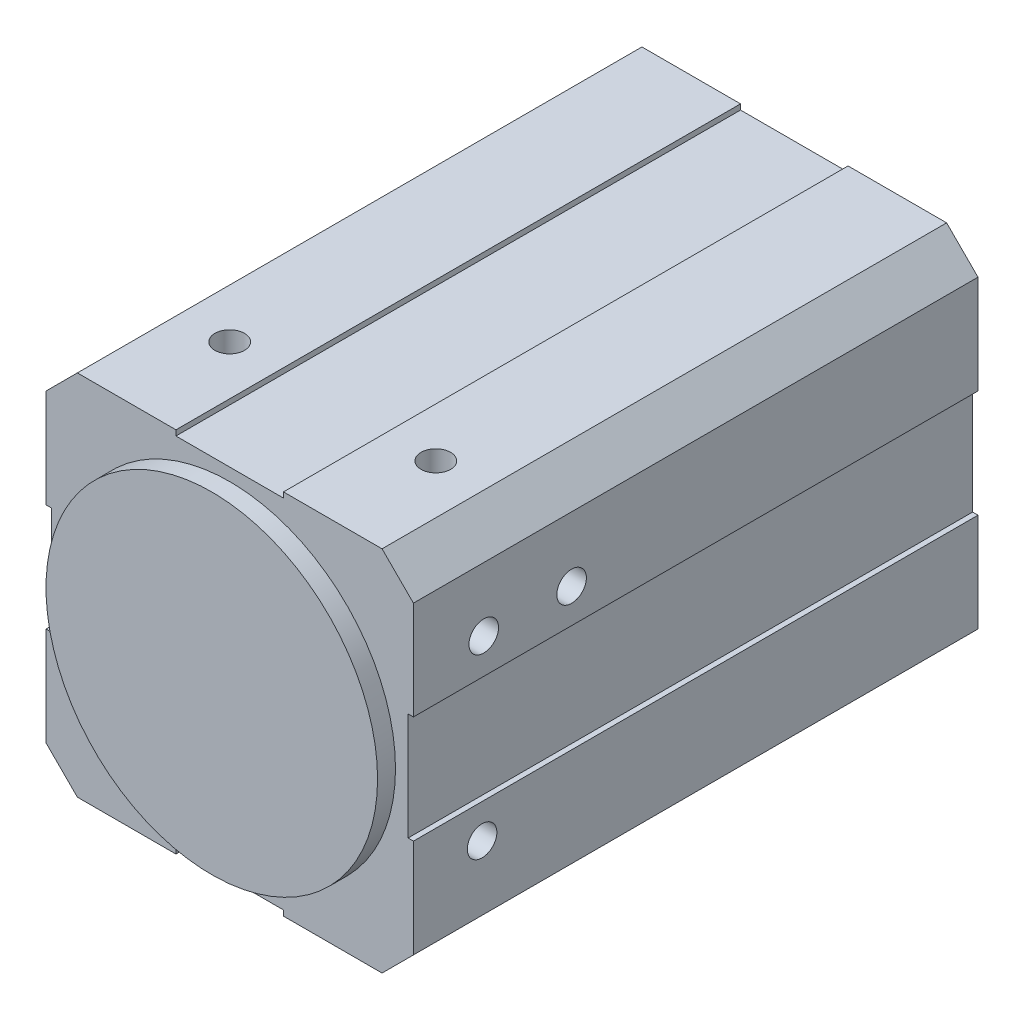
ISO-10303-21;
HEADER;
FILE_DESCRIPTION(('STEP AP214'),'2;1');
FILE_NAME('part.step','',(''),(''),'','','');
FILE_SCHEMA(('AUTOMOTIVE_DESIGN { 1 0 10303 214 1 1 1 1 }'));
ENDSEC;
DATA;
#1=APPLICATION_CONTEXT('core data for automotive mechanical design processes');
#2=APPLICATION_PROTOCOL_DEFINITION('international standard','automotive_design',2000,#1);
#3=PRODUCT_CONTEXT('',#1,'mechanical');
#4=PRODUCT('Part','Part','',(#3));
#5=PRODUCT_RELATED_PRODUCT_CATEGORY('part','',(#4));
#6=PRODUCT_DEFINITION_FORMATION('','',#4);
#7=PRODUCT_DEFINITION_CONTEXT('part definition',#1,'design');
#8=PRODUCT_DEFINITION('design','',#6,#7);
#9=PRODUCT_DEFINITION_SHAPE('','',#8);
#10=(LENGTH_UNIT() NAMED_UNIT(*) SI_UNIT(.MILLI.,.METRE.));
#11=(NAMED_UNIT(*) PLANE_ANGLE_UNIT() SI_UNIT($,.RADIAN.));
#12=(NAMED_UNIT(*) SI_UNIT($,.STERADIAN.) SOLID_ANGLE_UNIT());
#13=UNCERTAINTY_MEASURE_WITH_UNIT(LENGTH_MEASURE(1.E-05),#10,'distance_accuracy_value','');
#14=(GEOMETRIC_REPRESENTATION_CONTEXT(3) GLOBAL_UNCERTAINTY_ASSIGNED_CONTEXT((#13)) GLOBAL_UNIT_ASSIGNED_CONTEXT((#10,
#11,#12)) REPRESENTATION_CONTEXT('',''));
#15=CARTESIAN_POINT('',(0.,0.,0.));
#16=DIRECTION('',(0.,0.,1.));
#17=DIRECTION('',(1.,0.,0.));
#18=AXIS2_PLACEMENT_3D('',#15,#16,#17);
#19=CARTESIAN_POINT('',(20.5,41.,-31.5));
#20=DIRECTION('',(-1.,0.,0.));
#21=DIRECTION('',(0.,0.,1.));
#22=AXIS2_PLACEMENT_3D('',#19,#20,#21);
#23=PLANE('',#22);
#24=CARTESIAN_POINT('',(20.5,10.704410149387,23.839572383917));
#25=DIRECTION('',(1.,0.,0.));
#26=DIRECTION('',(0.,0.,-1.));
#27=AXIS2_PLACEMENT_3D('',#24,#25,#26);
#28=CIRCLE('',#27,1.64999999999999);
#29=CARTESIAN_POINT('',(20.5,10.704410149387,22.189572383917));
#30=VERTEX_POINT('',#29);
#31=EDGE_CURVE('E250',#30,#30,#28,.T.);
#32=ORIENTED_EDGE('',*,*,#31,.F.);
#33=EDGE_LOOP('',(#32));
#34=FACE_BOUND('',#33,.T.);
#35=DIRECTION('',(0.,-1.,0.));
#36=VECTOR('',#35,1.);
#37=CARTESIAN_POINT('',(20.5,41.,-31.5));
#38=LINE('',#37,#36);
#39=CARTESIAN_POINT('',(20.5,14.5000000000013,-31.5));
#40=VERTEX_POINT('',#39);
#41=CARTESIAN_POINT('',(20.5,3.49999999999999,-31.5));
#42=VERTEX_POINT('',#41);
#43=EDGE_CURVE('E413',#40,#42,#38,.T.);
#44=ORIENTED_EDGE('',*,*,#43,.F.);
#45=DIRECTION('',(0.,0.,1.));
#46=VECTOR('',#45,1.);
#47=CARTESIAN_POINT('',(20.5000000000014,14.5000000000013,-31.501));
#48=LINE('',#47,#46);
#49=CARTESIAN_POINT('',(20.5000000000014,14.5000000000013,31.5));
#50=VERTEX_POINT('',#49);
#51=EDGE_CURVE('E309',#40,#50,#48,.T.);
#52=ORIENTED_EDGE('',*,*,#51,.T.);
#53=DIRECTION('',(0.,-1.,0.));
#54=VECTOR('',#53,1.);
#55=CARTESIAN_POINT('',(20.5,41.,31.5));
#56=LINE('',#55,#54);
#57=CARTESIAN_POINT('',(20.5,3.49999999999999,31.5));
#58=VERTEX_POINT('',#57);
#59=EDGE_CURVE('E394',#50,#58,#56,.T.);
#60=ORIENTED_EDGE('',*,*,#59,.T.);
#61=DIRECTION('',(0.,0.,-1.));
#62=VECTOR('',#61,1.);
#63=CARTESIAN_POINT('',(20.5,3.49999999999999,-31.5));
#64=LINE('',#63,#62);
#65=EDGE_CURVE('E450',#58,#42,#64,.T.);
#66=ORIENTED_EDGE('',*,*,#65,.T.);
#67=EDGE_LOOP('',(#44,#52,#60,#66));
#68=FACE_BOUND('',#67,.T.);
#69=ADVANCED_FACE('F42',(#34,#68),#23,.F.);
#70=CARTESIAN_POINT('',(-20.5,41.,-31.5));
#71=DIRECTION('',(1.,0.,0.));
#72=DIRECTION('',(0.,0.,-1.));
#73=AXIS2_PLACEMENT_3D('',#70,#71,#72);
#74=PLANE('',#73);
#75=DIRECTION('',(0.,-1.,0.));
#76=VECTOR('',#75,1.);
#77=CARTESIAN_POINT('',(-20.5,41.,-31.5));
#78=LINE('',#77,#76);
#79=CARTESIAN_POINT('',(-20.5,37.5,-31.5));
#80=VERTEX_POINT('',#79);
#81=CARTESIAN_POINT('',(-20.5,26.4999999999988,-31.5));
#82=VERTEX_POINT('',#81);
#83=EDGE_CURVE('E410',#80,#82,#78,.T.);
#84=ORIENTED_EDGE('',*,*,#83,.T.);
#85=DIRECTION('',(0.,0.,1.));
#86=VECTOR('',#85,1.);
#87=CARTESIAN_POINT('',(-20.4999999999985,26.4999999999988,-31.501));
#88=LINE('',#87,#86);
#89=CARTESIAN_POINT('',(-20.4999999999985,26.4999999999988,31.5));
#90=VERTEX_POINT('',#89);
#91=EDGE_CURVE('E355',#82,#90,#88,.T.);
#92=ORIENTED_EDGE('',*,*,#91,.T.);
#93=DIRECTION('',(0.,-1.,0.));
#94=VECTOR('',#93,1.);
#95=CARTESIAN_POINT('',(-20.5,41.,31.5));
#96=LINE('',#95,#94);
#97=CARTESIAN_POINT('',(-20.5,37.5,31.5));
#98=VERTEX_POINT('',#97);
#99=EDGE_CURVE('E406',#98,#90,#96,.T.);
#100=ORIENTED_EDGE('',*,*,#99,.F.);
#101=DIRECTION('',(0.,0.,-1.));
#102=VECTOR('',#101,1.);
#103=CARTESIAN_POINT('',(-20.5,37.5,-31.5));
#104=LINE('',#103,#102);
#105=EDGE_CURVE('E417',#98,#80,#104,.T.);
#106=ORIENTED_EDGE('',*,*,#105,.T.);
#107=EDGE_LOOP('',(#84,#92,#100,#106));
#108=FACE_BOUND('',#107,.T.);
#109=ADVANCED_FACE('F485',(#108),#74,.F.);
#110=CARTESIAN_POINT('',(0.,41.,0.));
#111=DIRECTION('',(0.,1.,0.));
#112=DIRECTION('',(0.,0.,1.));
#113=AXIS2_PLACEMENT_3D('',#110,#111,#112);
#114=PLANE('',#113);
#115=DIRECTION('',(0.,0.,1.));
#116=VECTOR('',#115,1.);
#117=CARTESIAN_POINT('',(6.,41.,-31.501));
#118=LINE('',#117,#116);
#119=CARTESIAN_POINT('',(6.,41.,-31.5));
#120=VERTEX_POINT('',#119);
#121=CARTESIAN_POINT('',(6.,41.,31.5));
#122=VERTEX_POINT('',#121);
#123=EDGE_CURVE('E283',#120,#122,#118,.T.);
#124=ORIENTED_EDGE('',*,*,#123,.T.);
#125=DIRECTION('',(1.,0.,0.));
#126=VECTOR('',#125,1.);
#127=CARTESIAN_POINT('',(-20.5,41.,31.5));
#128=LINE('',#127,#126);
#129=CARTESIAN_POINT('',(17.,41.,31.5));
#130=VERTEX_POINT('',#129);
#131=EDGE_CURVE('E389',#122,#130,#128,.T.);
#132=ORIENTED_EDGE('',*,*,#131,.T.);
#133=DIRECTION('',(0.,0.,-1.));
#134=VECTOR('',#133,1.);
#135=CARTESIAN_POINT('',(17.,41.,-31.5));
#136=LINE('',#135,#134);
#137=CARTESIAN_POINT('',(17.,41.,-31.5));
#138=VERTEX_POINT('',#137);
#139=EDGE_CURVE('E452',#130,#138,#136,.T.);
#140=ORIENTED_EDGE('',*,*,#139,.T.);
#141=DIRECTION('',(-1.,0.,0.));
#142=VECTOR('',#141,1.);
#143=CARTESIAN_POINT('',(-20.5,41.,-31.5));
#144=LINE('',#143,#142);
#145=EDGE_CURVE('E386',#138,#120,#144,.T.);
#146=ORIENTED_EDGE('',*,*,#145,.T.);
#147=EDGE_LOOP('',(#124,#132,#140,#146));
#148=FACE_BOUND('',#147,.T.);
#149=CARTESIAN_POINT('',(11.5,41.,20.));
#150=DIRECTION('',(0.,1.,0.));
#151=DIRECTION('',(0.,0.,1.));
#152=AXIS2_PLACEMENT_3D('',#149,#150,#151);
#153=CIRCLE('',#152,1.65);
#154=CARTESIAN_POINT('',(11.5,41.,21.65));
#155=VERTEX_POINT('',#154);
#156=EDGE_CURVE('E379',#155,#155,#153,.T.);
#157=ORIENTED_EDGE('',*,*,#156,.F.);
#158=EDGE_LOOP('',(#157));
#159=FACE_BOUND('',#158,.T.);
#160=ADVANCED_FACE('F550',(#148,#159),#114,.T.);
#161=CARTESIAN_POINT('',(0.,0.,0.));
#162=DIRECTION('',(0.,1.,0.));
#163=DIRECTION('',(0.,0.,1.));
#164=AXIS2_PLACEMENT_3D('',#161,#162,#163);
#165=PLANE('',#164);
#166=CARTESIAN_POINT('',(-11.5,0.,20.));
#167=DIRECTION('',(0.,-1.,0.));
#168=DIRECTION('',(0.,0.,-1.));
#169=AXIS2_PLACEMENT_3D('',#166,#167,#168);
#170=CIRCLE('',#169,1.65);
#171=CARTESIAN_POINT('',(-11.5,0.,18.35));
#172=VERTEX_POINT('',#171);
#173=EDGE_CURVE('E286',#172,#172,#170,.T.);
#174=ORIENTED_EDGE('',*,*,#173,.F.);
#175=EDGE_LOOP('',(#174));
#176=FACE_BOUND('',#175,.T.);
#177=DIRECTION('',(-1.,0.,0.));
#178=VECTOR('',#177,1.);
#179=CARTESIAN_POINT('',(-20.5,0.,-31.5));
#180=LINE('',#179,#178);
#181=CARTESIAN_POINT('',(-5.99999999999732,0.,-31.5));
#182=VERTEX_POINT('',#181);
#183=CARTESIAN_POINT('',(-17.,0.,-31.5));
#184=VERTEX_POINT('',#183);
#185=EDGE_CURVE('E385',#182,#184,#180,.T.);
#186=ORIENTED_EDGE('',*,*,#185,.F.);
#187=DIRECTION('',(0.,0.,1.));
#188=VECTOR('',#187,1.);
#189=CARTESIAN_POINT('',(-5.99999999999732,0.,-31.501));
#190=LINE('',#189,#188);
#191=CARTESIAN_POINT('',(-5.99999999999732,0.,31.5));
#192=VERTEX_POINT('',#191);
#193=EDGE_CURVE('E333',#182,#192,#190,.T.);
#194=ORIENTED_EDGE('',*,*,#193,.T.);
#195=DIRECTION('',(1.,0.,0.));
#196=VECTOR('',#195,1.);
#197=CARTESIAN_POINT('',(-20.5,0.,31.5));
#198=LINE('',#197,#196);
#199=CARTESIAN_POINT('',(-17.,0.,31.5));
#200=VERTEX_POINT('',#199);
#201=EDGE_CURVE('E399',#200,#192,#198,.T.);
#202=ORIENTED_EDGE('',*,*,#201,.F.);
#203=DIRECTION('',(0.,0.,-1.));
#204=VECTOR('',#203,1.);
#205=CARTESIAN_POINT('',(-17.,0.,0.));
#206=LINE('',#205,#204);
#207=EDGE_CURVE('E435',#200,#184,#206,.T.);
#208=ORIENTED_EDGE('',*,*,#207,.T.);
#209=EDGE_LOOP('',(#186,#194,#202,#208));
#210=FACE_BOUND('',#209,.T.);
#211=ADVANCED_FACE('F509',(#176,#210),#165,.F.);
#212=CARTESIAN_POINT('',(20.5,30.4053543644934,23.651006077266));
#213=DIRECTION('',(1.,0.,0.));
#214=DIRECTION('',(0.,0.,-1.));
#215=AXIS2_PLACEMENT_3D('',#212,#213,#214);
#216=CIRCLE('',#215,1.64999999999999);
#217=CARTESIAN_POINT('',(20.5,30.4053543644934,22.001006077266));
#218=VERTEX_POINT('',#217);
#219=EDGE_CURVE('E240',#218,#218,#216,.T.);
#220=ORIENTED_EDGE('',*,*,#219,.F.);
#221=EDGE_LOOP('',(#220));
#222=FACE_BOUND('',#221,.T.);
#223=CARTESIAN_POINT('',(20.5,30.3064629667241,13.8510121734329));
#224=DIRECTION('',(1.,0.,0.));
#225=DIRECTION('',(0.,0.,-1.));
#226=AXIS2_PLACEMENT_3D('',#223,#224,#225);
#227=CIRCLE('',#226,1.64999999999999);
#228=CARTESIAN_POINT('',(20.5,30.3064629667241,12.2010121734329));
#229=VERTEX_POINT('',#228);
#230=EDGE_CURVE('E239',#229,#229,#227,.T.);
#231=ORIENTED_EDGE('',*,*,#230,.F.);
#232=EDGE_LOOP('',(#231));
#233=FACE_BOUND('',#232,.T.);
#234=CARTESIAN_POINT('',(20.5,37.5,31.5));
#235=VERTEX_POINT('',#234);
#236=CARTESIAN_POINT('',(20.5,26.5000000000013,31.5));
#237=VERTEX_POINT('',#236);
#238=EDGE_CURVE('E402',#235,#237,#56,.T.);
#239=ORIENTED_EDGE('',*,*,#238,.T.);
#240=DIRECTION('',(0.,0.,1.));
#241=VECTOR('',#240,1.);
#242=CARTESIAN_POINT('',(20.5000000000014,26.5000000000013,-31.501));
#243=LINE('',#242,#241);
#244=CARTESIAN_POINT('',(20.5000000000014,26.5000000000013,-31.5));
#245=VERTEX_POINT('',#244);
#246=EDGE_CURVE('E59',#245,#237,#243,.T.);
#247=ORIENTED_EDGE('',*,*,#246,.F.);
#248=CARTESIAN_POINT('',(20.5,37.5,-31.5));
#249=VERTEX_POINT('',#248);
#250=EDGE_CURVE('E414',#249,#245,#38,.T.);
#251=ORIENTED_EDGE('',*,*,#250,.F.);
#252=DIRECTION('',(0.,0.,1.));
#253=VECTOR('',#252,1.);
#254=CARTESIAN_POINT('',(20.5,37.5,31.5));
#255=LINE('',#254,#253);
#256=EDGE_CURVE('E448',#249,#235,#255,.T.);
#257=ORIENTED_EDGE('',*,*,#256,.T.);
#258=EDGE_LOOP('',(#239,#247,#251,#257));
#259=FACE_BOUND('',#258,.T.);
#260=ADVANCED_FACE('F546',(#222,#233,#259),#23,.F.);
#261=CARTESIAN_POINT('',(-20.5,41.,-31.5));
#262=DIRECTION('',(0.,0.,1.));
#263=DIRECTION('',(1.,0.,0.));
#264=AXIS2_PLACEMENT_3D('',#261,#262,#263);
#265=PLANE('',#264);
#266=DIRECTION('',(-1.,0.,0.));
#267=VECTOR('',#266,1.);
#268=CARTESIAN_POINT('',(-6.,40.4,-31.5));
#269=LINE('',#268,#267);
#270=CARTESIAN_POINT('',(6.,40.4,-31.5));
#271=VERTEX_POINT('',#270);
#272=CARTESIAN_POINT('',(-6.,40.4,-31.5));
#273=VERTEX_POINT('',#272);
#274=EDGE_CURVE('E268',#271,#273,#269,.T.);
#275=ORIENTED_EDGE('',*,*,#274,.F.);
#276=DIRECTION('',(0.,-1.,0.));
#277=VECTOR('',#276,1.);
#278=CARTESIAN_POINT('',(6.,40.4,-31.5));
#279=LINE('',#278,#277);
#280=EDGE_CURVE('E272',#120,#271,#279,.T.);
#281=ORIENTED_EDGE('',*,*,#280,.F.);
#282=ORIENTED_EDGE('',*,*,#145,.F.);
#283=DIRECTION('',(0.707106781186547,-0.707106781186548,0.));
#284=VECTOR('',#283,1.);
#285=CARTESIAN_POINT('',(17.,41.,-31.5));
#286=LINE('',#285,#284);
#287=EDGE_CURVE('E438',#138,#249,#286,.T.);
#288=ORIENTED_EDGE('',*,*,#287,.T.);
#289=ORIENTED_EDGE('',*,*,#250,.T.);
#290=DIRECTION('',(1.,0.,0.));
#291=VECTOR('',#290,1.);
#292=CARTESIAN_POINT('',(19.9000000000014,26.5000000000013,-31.5));
#293=LINE('',#292,#291);
#294=CARTESIAN_POINT('',(19.9000000000014,26.5000000000013,-31.5));
#295=VERTEX_POINT('',#294);
#296=EDGE_CURVE('E293',#295,#245,#293,.T.);
#297=ORIENTED_EDGE('',*,*,#296,.F.);
#298=DIRECTION('',(0.,1.,0.));
#299=VECTOR('',#298,1.);
#300=CARTESIAN_POINT('',(19.9000000000014,26.5000000000013,-31.5));
#301=LINE('',#300,#299);
#302=CARTESIAN_POINT('',(19.9000000000014,14.5000000000013,-31.5));
#303=VERTEX_POINT('',#302);
#304=EDGE_CURVE('E295',#303,#295,#301,.T.);
#305=ORIENTED_EDGE('',*,*,#304,.F.);
#306=DIRECTION('',(-1.,0.,0.));
#307=VECTOR('',#306,1.);
#308=CARTESIAN_POINT('',(19.9000000000014,14.5000000000013,-31.5));
#309=LINE('',#308,#307);
#310=EDGE_CURVE('E299',#40,#303,#309,.T.);
#311=ORIENTED_EDGE('',*,*,#310,.F.);
#312=ORIENTED_EDGE('',*,*,#43,.T.);
#313=DIRECTION('',(0.707106781186549,0.707106781186546,0.));
#314=VECTOR('',#313,1.);
#315=CARTESIAN_POINT('',(20.5,3.49999999999999,-31.5));
#316=LINE('',#315,#314);
#317=CARTESIAN_POINT('',(17.,0.,-31.5));
#318=VERTEX_POINT('',#317);
#319=EDGE_CURVE('E443',#42,#318,#316,.F.);
#320=ORIENTED_EDGE('',*,*,#319,.T.);
#321=CARTESIAN_POINT('',(6.00000000000268,0.,-31.5));
#322=VERTEX_POINT('',#321);
#323=EDGE_CURVE('E395',#318,#322,#180,.T.);
#324=ORIENTED_EDGE('',*,*,#323,.T.);
#325=DIRECTION('',(0.,-1.,0.));
#326=VECTOR('',#325,1.);
#327=CARTESIAN_POINT('',(6.00000000000268,0.599999999999962,-31.5));
#328=LINE('',#327,#326);
#329=CARTESIAN_POINT('',(6.00000000000268,0.599999999999962,-31.5));
#330=VERTEX_POINT('',#329);
#331=EDGE_CURVE('E316',#330,#322,#328,.T.);
#332=ORIENTED_EDGE('',*,*,#331,.F.);
#333=DIRECTION('',(1.,0.,0.));
#334=VECTOR('',#333,1.);
#335=CARTESIAN_POINT('',(6.00000000000268,0.599999999999962,-31.5));
#336=LINE('',#335,#334);
#337=CARTESIAN_POINT('',(-5.99999999999732,0.600000000000045,-31.5));
#338=VERTEX_POINT('',#337);
#339=EDGE_CURVE('E318',#338,#330,#336,.T.);
#340=ORIENTED_EDGE('',*,*,#339,.F.);
#341=DIRECTION('',(0.,1.,0.));
#342=VECTOR('',#341,1.);
#343=CARTESIAN_POINT('',(-5.99999999999732,0.600000000000045,-31.5));
#344=LINE('',#343,#342);
#345=EDGE_CURVE('E322',#182,#338,#344,.T.);
#346=ORIENTED_EDGE('',*,*,#345,.F.);
#347=ORIENTED_EDGE('',*,*,#185,.T.);
#348=DIRECTION('',(0.707106781186549,-0.707106781186546,0.));
#349=VECTOR('',#348,1.);
#350=CARTESIAN_POINT('',(-20.5,3.49999999999999,-31.5));
#351=LINE('',#350,#349);
#352=CARTESIAN_POINT('',(-20.5,3.49999999999999,-31.5));
#353=VERTEX_POINT('',#352);
#354=EDGE_CURVE('E445',#184,#353,#351,.F.);
#355=ORIENTED_EDGE('',*,*,#354,.T.);
#356=CARTESIAN_POINT('',(-20.4999999999987,14.4999999999988,-31.5));
#357=VERTEX_POINT('',#356);
#358=EDGE_CURVE('E409',#357,#353,#78,.T.);
#359=ORIENTED_EDGE('',*,*,#358,.F.);
#360=DIRECTION('',(-1.,0.,0.));
#361=VECTOR('',#360,1.);
#362=CARTESIAN_POINT('',(-19.8999999999987,14.4999999999988,-31.5));
#363=LINE('',#362,#361);
#364=CARTESIAN_POINT('',(-19.8999999999987,14.4999999999988,-31.5));
#365=VERTEX_POINT('',#364);
#366=EDGE_CURVE('E264',#365,#357,#363,.T.);
#367=ORIENTED_EDGE('',*,*,#366,.F.);
#368=DIRECTION('',(0.,-1.,0.));
#369=VECTOR('',#368,1.);
#370=CARTESIAN_POINT('',(-19.8999999999987,14.4999999999988,-31.5));
#371=LINE('',#370,#369);
#372=CARTESIAN_POINT('',(-19.8999999999985,26.4999999999988,-31.5));
#373=VERTEX_POINT('',#372);
#374=EDGE_CURVE('E342',#373,#365,#371,.T.);
#375=ORIENTED_EDGE('',*,*,#374,.F.);
#376=DIRECTION('',(1.,0.,0.));
#377=VECTOR('',#376,1.);
#378=CARTESIAN_POINT('',(-19.8999999999985,26.4999999999988,-31.5));
#379=LINE('',#378,#377);
#380=EDGE_CURVE('E345',#82,#373,#379,.T.);
#381=ORIENTED_EDGE('',*,*,#380,.F.);
#382=ORIENTED_EDGE('',*,*,#83,.F.);
#383=DIRECTION('',(0.707106781186547,0.707106781186548,0.));
#384=VECTOR('',#383,1.);
#385=CARTESIAN_POINT('',(-17.,41.,-31.5));
#386=LINE('',#385,#384);
#387=CARTESIAN_POINT('',(-17.,41.,-31.5));
#388=VERTEX_POINT('',#387);
#389=EDGE_CURVE('E440',#80,#388,#386,.T.);
#390=ORIENTED_EDGE('',*,*,#389,.T.);
#391=CARTESIAN_POINT('',(-6.,41.,-31.5));
#392=VERTEX_POINT('',#391);
#393=EDGE_CURVE('E390',#392,#388,#144,.T.);
#394=ORIENTED_EDGE('',*,*,#393,.F.);
#395=DIRECTION('',(0.,1.,0.));
#396=VECTOR('',#395,1.);
#397=CARTESIAN_POINT('',(-6.,40.4,-31.5));
#398=LINE('',#397,#396);
#399=EDGE_CURVE('E266',#273,#392,#398,.T.);
#400=ORIENTED_EDGE('',*,*,#399,.F.);
#401=EDGE_LOOP('',(#275,#281,#282,#288,#289,#297,#305,#311,#312,#320,#324,#332,#340,#346,#347,
#355,#359,#367,#375,#381,#382,#390,#394,#400));
#402=FACE_BOUND('',#401,.T.);
#403=ADVANCED_FACE('F479',(#402),#265,.F.);
#404=CARTESIAN_POINT('',(-20.5,7.687513873343,-0.982360161491077));
#405=DIRECTION('',(-1.,0.,0.));
#406=DIRECTION('',(0.,0.,1.));
#407=AXIS2_PLACEMENT_3D('',#404,#405,#406);
#408=CIRCLE('',#407,1.64999999999999);
#409=CARTESIAN_POINT('',(-20.5,7.687513873343,0.667639838508913));
#410=VERTEX_POINT('',#409);
#411=EDGE_CURVE('E256',#410,#410,#408,.T.);
#412=ORIENTED_EDGE('',*,*,#411,.F.);
#413=EDGE_LOOP('',(#412));
#414=FACE_BOUND('',#413,.T.);
#415=CARTESIAN_POINT('',(-20.5,14.4999999999988,31.5));
#416=VERTEX_POINT('',#415);
#417=CARTESIAN_POINT('',(-20.5,3.49999999999999,31.5));
#418=VERTEX_POINT('',#417);
#419=EDGE_CURVE('E405',#416,#418,#96,.T.);
#420=ORIENTED_EDGE('',*,*,#419,.F.);
#421=DIRECTION('',(0.,0.,1.));
#422=VECTOR('',#421,1.);
#423=CARTESIAN_POINT('',(-20.4999999999987,14.4999999999988,-31.501));
#424=LINE('',#423,#422);
#425=EDGE_CURVE('E67',#357,#416,#424,.T.);
#426=ORIENTED_EDGE('',*,*,#425,.F.);
#427=ORIENTED_EDGE('',*,*,#358,.T.);
#428=DIRECTION('',(0.,0.,1.));
#429=VECTOR('',#428,1.);
#430=CARTESIAN_POINT('',(-20.5,3.49999999999999,-31.5));
#431=LINE('',#430,#429);
#432=EDGE_CURVE('E419',#353,#418,#431,.T.);
#433=ORIENTED_EDGE('',*,*,#432,.T.);
#434=EDGE_LOOP('',(#420,#426,#427,#433));
#435=FACE_BOUND('',#434,.T.);
#436=ADVANCED_FACE('F498',(#414,#435),#74,.F.);
#437=CARTESIAN_POINT('',(-20.5,41.,31.5));
#438=DIRECTION('',(0.,0.,-1.));
#439=DIRECTION('',(-1.,0.,0.));
#440=AXIS2_PLACEMENT_3D('',#437,#438,#439);
#441=PLANE('',#440);
#442=CARTESIAN_POINT('',(0.,20.5,31.5));
#443=DIRECTION('',(0.,0.,1.));
#444=DIRECTION('',(1.,0.,0.));
#445=AXIS2_PLACEMENT_3D('',#442,#443,#444);
#446=CIRCLE('',#445,18.5);
#447=CARTESIAN_POINT('',(18.5,20.5,31.5));
#448=VERTEX_POINT('',#447);
#449=EDGE_CURVE('E11',#448,#448,#446,.T.);
#450=ORIENTED_EDGE('',*,*,#449,.F.);
#451=EDGE_LOOP('',(#450));
#452=FACE_BOUND('',#451,.T.);
#453=ORIENTED_EDGE('',*,*,#131,.F.);
#454=DIRECTION('',(0.,1.,0.));
#455=VECTOR('',#454,1.);
#456=CARTESIAN_POINT('',(6.,40.4,31.5));
#457=LINE('',#456,#455);
#458=CARTESIAN_POINT('',(6.,40.4,31.5));
#459=VERTEX_POINT('',#458);
#460=EDGE_CURVE('E275',#459,#122,#457,.T.);
#461=ORIENTED_EDGE('',*,*,#460,.F.);
#462=DIRECTION('',(1.,0.,0.));
#463=VECTOR('',#462,1.);
#464=CARTESIAN_POINT('',(-6.,40.4,31.5));
#465=LINE('',#464,#463);
#466=CARTESIAN_POINT('',(-6.,40.4,31.5));
#467=VERTEX_POINT('',#466);
#468=EDGE_CURVE('E280',#467,#459,#465,.T.);
#469=ORIENTED_EDGE('',*,*,#468,.F.);
#470=DIRECTION('',(0.,-1.,0.));
#471=VECTOR('',#470,1.);
#472=CARTESIAN_POINT('',(-6.,40.4,31.5));
#473=LINE('',#472,#471);
#474=CARTESIAN_POINT('',(-6.,41.,31.5));
#475=VERTEX_POINT('',#474);
#476=EDGE_CURVE('E277',#475,#467,#473,.T.);
#477=ORIENTED_EDGE('',*,*,#476,.F.);
#478=CARTESIAN_POINT('',(-17.,41.,31.5));
#479=VERTEX_POINT('',#478);
#480=EDGE_CURVE('E391',#479,#475,#128,.T.);
#481=ORIENTED_EDGE('',*,*,#480,.F.);
#482=DIRECTION('',(-0.707106781186547,-0.707106781186548,0.));
#483=VECTOR('',#482,1.);
#484=CARTESIAN_POINT('',(-17.,41.,31.5));
#485=LINE('',#484,#483);
#486=EDGE_CURVE('E425',#479,#98,#485,.T.);
#487=ORIENTED_EDGE('',*,*,#486,.T.);
#488=ORIENTED_EDGE('',*,*,#99,.T.);
#489=DIRECTION('',(-1.,0.,0.));
#490=VECTOR('',#489,1.);
#491=CARTESIAN_POINT('',(-19.8999999999985,26.4999999999988,31.5));
#492=LINE('',#491,#490);
#493=CARTESIAN_POINT('',(-19.8999999999985,26.4999999999988,31.5));
#494=VERTEX_POINT('',#493);
#495=EDGE_CURVE('E348',#494,#90,#492,.T.);
#496=ORIENTED_EDGE('',*,*,#495,.F.);
#497=DIRECTION('',(0.,1.,0.));
#498=VECTOR('',#497,1.);
#499=CARTESIAN_POINT('',(-19.8999999999987,14.4999999999988,31.5));
#500=LINE('',#499,#498);
#501=CARTESIAN_POINT('',(-19.8999999999987,14.4999999999988,31.5));
#502=VERTEX_POINT('',#501);
#503=EDGE_CURVE('E352',#502,#494,#500,.T.);
#504=ORIENTED_EDGE('',*,*,#503,.F.);
#505=DIRECTION('',(1.,0.,0.));
#506=VECTOR('',#505,1.);
#507=CARTESIAN_POINT('',(-19.8999999999987,14.4999999999988,31.5));
#508=LINE('',#507,#506);
#509=EDGE_CURVE('E350',#416,#502,#508,.T.);
#510=ORIENTED_EDGE('',*,*,#509,.F.);
#511=ORIENTED_EDGE('',*,*,#419,.T.);
#512=DIRECTION('',(-0.707106781186549,0.707106781186546,0.));
#513=VECTOR('',#512,1.);
#514=CARTESIAN_POINT('',(-20.5,3.49999999999999,31.5));
#515=LINE('',#514,#513);
#516=EDGE_CURVE('E430',#418,#200,#515,.F.);
#517=ORIENTED_EDGE('',*,*,#516,.T.);
#518=ORIENTED_EDGE('',*,*,#201,.T.);
#519=DIRECTION('',(0.,-1.,0.));
#520=VECTOR('',#519,1.);
#521=CARTESIAN_POINT('',(-5.99999999999732,0.600000000000045,31.5));
#522=LINE('',#521,#520);
#523=CARTESIAN_POINT('',(-5.99999999999732,0.600000000000045,31.5));
#524=VERTEX_POINT('',#523);
#525=EDGE_CURVE('E325',#524,#192,#522,.T.);
#526=ORIENTED_EDGE('',*,*,#525,.F.);
#527=DIRECTION('',(-1.,0.,0.));
#528=VECTOR('',#527,1.);
#529=CARTESIAN_POINT('',(6.00000000000268,0.599999999999962,31.5));
#530=LINE('',#529,#528);
#531=CARTESIAN_POINT('',(6.00000000000268,0.599999999999962,31.5));
#532=VERTEX_POINT('',#531);
#533=EDGE_CURVE('E330',#532,#524,#530,.T.);
#534=ORIENTED_EDGE('',*,*,#533,.F.);
#535=DIRECTION('',(0.,1.,0.));
#536=VECTOR('',#535,1.);
#537=CARTESIAN_POINT('',(6.00000000000268,0.599999999999962,31.5));
#538=LINE('',#537,#536);
#539=CARTESIAN_POINT('',(6.00000000000268,0.,31.5));
#540=VERTEX_POINT('',#539);
#541=EDGE_CURVE('E327',#540,#532,#538,.T.);
#542=ORIENTED_EDGE('',*,*,#541,.F.);
#543=CARTESIAN_POINT('',(17.,0.,31.5));
#544=VERTEX_POINT('',#543);
#545=EDGE_CURVE('E398',#540,#544,#198,.T.);
#546=ORIENTED_EDGE('',*,*,#545,.T.);
#547=DIRECTION('',(-0.707106781186549,-0.707106781186546,0.));
#548=VECTOR('',#547,1.);
#549=CARTESIAN_POINT('',(20.5,3.49999999999999,31.5));
#550=LINE('',#549,#548);
#551=EDGE_CURVE('E427',#544,#58,#550,.F.);
#552=ORIENTED_EDGE('',*,*,#551,.T.);
#553=ORIENTED_EDGE('',*,*,#59,.F.);
#554=DIRECTION('',(1.,0.,0.));
#555=VECTOR('',#554,1.);
#556=CARTESIAN_POINT('',(19.9000000000014,14.5000000000013,31.5));
#557=LINE('',#556,#555);
#558=CARTESIAN_POINT('',(19.9000000000014,14.5000000000013,31.5));
#559=VERTEX_POINT('',#558);
#560=EDGE_CURVE('E302',#559,#50,#557,.T.);
#561=ORIENTED_EDGE('',*,*,#560,.F.);
#562=DIRECTION('',(0.,-1.,0.));
#563=VECTOR('',#562,1.);
#564=CARTESIAN_POINT('',(19.9000000000014,26.5000000000013,31.5));
#565=LINE('',#564,#563);
#566=CARTESIAN_POINT('',(19.9000000000014,26.5000000000013,31.5));
#567=VERTEX_POINT('',#566);
#568=EDGE_CURVE('E306',#567,#559,#565,.T.);
#569=ORIENTED_EDGE('',*,*,#568,.F.);
#570=DIRECTION('',(-1.,0.,0.));
#571=VECTOR('',#570,1.);
#572=CARTESIAN_POINT('',(19.9000000000014,26.5000000000013,31.5));
#573=LINE('',#572,#571);
#574=EDGE_CURVE('E304',#237,#567,#573,.T.);
#575=ORIENTED_EDGE('',*,*,#574,.F.);
#576=ORIENTED_EDGE('',*,*,#238,.F.);
#577=DIRECTION('',(-0.707106781186547,0.707106781186548,0.));
#578=VECTOR('',#577,1.);
#579=CARTESIAN_POINT('',(17.,41.,31.5));
#580=LINE('',#579,#578);
#581=EDGE_CURVE('E422',#235,#130,#580,.T.);
#582=ORIENTED_EDGE('',*,*,#581,.T.);
#583=EDGE_LOOP('',(#453,#461,#469,#477,#481,#487,#488,#496,#504,#510,#511,#517,#518,#526,#534,
#542,#546,#552,#553,#561,#569,#575,#576,#582));
#584=FACE_BOUND('',#583,.T.);
#585=ADVANCED_FACE('F470',(#452,#584),#441,.F.);
#586=DIRECTION('',(0.,0.,1.));
#587=VECTOR('',#586,1.);
#588=CARTESIAN_POINT('',(-6.,41.,-31.501));
#589=LINE('',#588,#587);
#590=EDGE_CURVE('E289',#392,#475,#589,.T.);
#591=ORIENTED_EDGE('',*,*,#590,.F.);
#592=ORIENTED_EDGE('',*,*,#393,.T.);
#593=DIRECTION('',(0.,0.,1.));
#594=VECTOR('',#593,1.);
#595=CARTESIAN_POINT('',(-17.,41.,31.5));
#596=LINE('',#595,#594);
#597=EDGE_CURVE('E47',#388,#479,#596,.T.);
#598=ORIENTED_EDGE('',*,*,#597,.T.);
#599=ORIENTED_EDGE('',*,*,#480,.T.);
#600=EDGE_LOOP('',(#591,#592,#598,#599));
#601=FACE_BOUND('',#600,.T.);
#602=CARTESIAN_POINT('',(-11.5,41.,20.));
#603=DIRECTION('',(0.,1.,0.));
#604=DIRECTION('',(0.,0.,1.));
#605=AXIS2_PLACEMENT_3D('',#602,#603,#604);
#606=CIRCLE('',#605,1.65);
#607=CARTESIAN_POINT('',(-11.5,41.,21.65));
#608=VERTEX_POINT('',#607);
#609=EDGE_CURVE('E373',#608,#608,#606,.T.);
#610=ORIENTED_EDGE('',*,*,#609,.F.);
#611=EDGE_LOOP('',(#610));
#612=FACE_BOUND('',#611,.T.);
#613=ADVANCED_FACE('F462',(#601,#612),#114,.T.);
#614=CARTESIAN_POINT('',(11.5,0.,20.));
#615=DIRECTION('',(0.,-1.,0.));
#616=DIRECTION('',(0.,0.,-1.));
#617=AXIS2_PLACEMENT_3D('',#614,#615,#616);
#618=CIRCLE('',#617,1.65);
#619=CARTESIAN_POINT('',(11.5,0.,18.35));
#620=VERTEX_POINT('',#619);
#621=EDGE_CURVE('E367',#620,#620,#618,.T.);
#622=ORIENTED_EDGE('',*,*,#621,.F.);
#623=EDGE_LOOP('',(#622));
#624=FACE_BOUND('',#623,.T.);
#625=ORIENTED_EDGE('',*,*,#545,.F.);
#626=DIRECTION('',(0.,0.,1.));
#627=VECTOR('',#626,1.);
#628=CARTESIAN_POINT('',(6.00000000000268,0.,-31.501));
#629=LINE('',#628,#627);
#630=EDGE_CURVE('E337',#322,#540,#629,.T.);
#631=ORIENTED_EDGE('',*,*,#630,.F.);
#632=ORIENTED_EDGE('',*,*,#323,.F.);
#633=DIRECTION('',(0.,0.,1.));
#634=VECTOR('',#633,1.);
#635=CARTESIAN_POINT('',(17.,0.,0.));
#636=LINE('',#635,#634);
#637=EDGE_CURVE('E432',#318,#544,#636,.T.);
#638=ORIENTED_EDGE('',*,*,#637,.T.);
#639=EDGE_LOOP('',(#625,#631,#632,#638));
#640=FACE_BOUND('',#639,.T.);
#641=ADVANCED_FACE('F523',(#624,#640),#165,.F.);
#642=CARTESIAN_POINT('',(11.5,35.,20.));
#643=DIRECTION('',(0.,1.,0.));
#644=DIRECTION('',(0.,0.,1.));
#645=AXIS2_PLACEMENT_3D('',#642,#643,#644);
#646=CONICAL_SURFACE('',#645,1.65,1.02974425867665);
#647=CARTESIAN_POINT('',(11.5,34.0085799786045,20.));
#648=VERTEX_POINT('',#647);
#649=VERTEX_LOOP('',#648);
#650=FACE_BOUND('',#649,.T.);
#651=CARTESIAN_POINT('',(11.5,35.,20.));
#652=DIRECTION('',(0.,1.,0.));
#653=DIRECTION('',(0.,0.,1.));
#654=AXIS2_PLACEMENT_3D('',#651,#652,#653);
#655=CIRCLE('',#654,1.65);
#656=CARTESIAN_POINT('',(11.5,35.,21.65));
#657=VERTEX_POINT('',#656);
#658=EDGE_CURVE('E382',#657,#657,#655,.T.);
#659=ORIENTED_EDGE('',*,*,#658,.T.);
#660=EDGE_LOOP('',(#659));
#661=FACE_BOUND('',#660,.T.);
#662=ADVANCED_FACE('F641',(#650,#661),#646,.F.);
#663=CARTESIAN_POINT('',(11.5,41.,20.));
#664=DIRECTION('',(0.,1.,0.));
#665=DIRECTION('',(0.,0.,1.));
#666=AXIS2_PLACEMENT_3D('',#663,#664,#665);
#667=CYLINDRICAL_SURFACE('',#666,1.65);
#668=ORIENTED_EDGE('',*,*,#658,.F.);
#669=EDGE_LOOP('',(#668));
#670=FACE_BOUND('',#669,.T.);
#671=ORIENTED_EDGE('',*,*,#156,.T.);
#672=EDGE_LOOP('',(#671));
#673=FACE_BOUND('',#672,.T.);
#674=ADVANCED_FACE('F646',(#670,#673),#667,.F.);
#675=CARTESIAN_POINT('',(-11.5,35.,20.));
#676=DIRECTION('',(0.,1.,0.));
#677=DIRECTION('',(0.,0.,1.));
#678=AXIS2_PLACEMENT_3D('',#675,#676,#677);
#679=CONICAL_SURFACE('',#678,1.65,1.02974425867665);
#680=CARTESIAN_POINT('',(-11.5,34.0085799786045,20.));
#681=VERTEX_POINT('',#680);
#682=VERTEX_LOOP('',#681);
#683=FACE_BOUND('',#682,.T.);
#684=CARTESIAN_POINT('',(-11.5,35.,20.));
#685=DIRECTION('',(0.,1.,0.));
#686=DIRECTION('',(0.,0.,1.));
#687=AXIS2_PLACEMENT_3D('',#684,#685,#686);
#688=CIRCLE('',#687,1.65);
#689=CARTESIAN_POINT('',(-11.5,35.,21.65));
#690=VERTEX_POINT('',#689);
#691=EDGE_CURVE('E376',#690,#690,#688,.T.);
#692=ORIENTED_EDGE('',*,*,#691,.T.);
#693=EDGE_LOOP('',(#692));
#694=FACE_BOUND('',#693,.T.);
#695=ADVANCED_FACE('F650',(#683,#694),#679,.F.);
#696=CARTESIAN_POINT('',(-11.5,41.,20.));
#697=DIRECTION('',(0.,1.,0.));
#698=DIRECTION('',(0.,0.,1.));
#699=AXIS2_PLACEMENT_3D('',#696,#697,#698);
#700=CYLINDRICAL_SURFACE('',#699,1.65);
#701=ORIENTED_EDGE('',*,*,#691,.F.);
#702=EDGE_LOOP('',(#701));
#703=FACE_BOUND('',#702,.T.);
#704=ORIENTED_EDGE('',*,*,#609,.T.);
#705=EDGE_LOOP('',(#704));
#706=FACE_BOUND('',#705,.T.);
#707=ADVANCED_FACE('F654',(#703,#706),#700,.F.);
#708=CARTESIAN_POINT('',(11.5,6.,20.));
#709=DIRECTION('',(0.,-1.,0.));
#710=DIRECTION('',(0.,0.,-1.));
#711=AXIS2_PLACEMENT_3D('',#708,#709,#710);
#712=CONICAL_SURFACE('',#711,1.65,1.02974425867665);
#713=CARTESIAN_POINT('',(11.5,6.99142002139547,20.));
#714=VERTEX_POINT('',#713);
#715=VERTEX_LOOP('',#714);
#716=FACE_BOUND('',#715,.T.);
#717=CARTESIAN_POINT('',(11.5,6.,20.));
#718=DIRECTION('',(0.,-1.,0.));
#719=DIRECTION('',(0.,0.,-1.));
#720=AXIS2_PLACEMENT_3D('',#717,#718,#719);
#721=CIRCLE('',#720,1.65);
#722=CARTESIAN_POINT('',(11.5,6.,18.35));
#723=VERTEX_POINT('',#722);
#724=EDGE_CURVE('E370',#723,#723,#721,.T.);
#725=ORIENTED_EDGE('',*,*,#724,.T.);
#726=EDGE_LOOP('',(#725));
#727=FACE_BOUND('',#726,.T.);
#728=ADVANCED_FACE('F658',(#716,#727),#712,.F.);
#729=CARTESIAN_POINT('',(11.5,0.,20.));
#730=DIRECTION('',(0.,-1.,0.));
#731=DIRECTION('',(0.,0.,-1.));
#732=AXIS2_PLACEMENT_3D('',#729,#730,#731);
#733=CYLINDRICAL_SURFACE('',#732,1.65);
#734=ORIENTED_EDGE('',*,*,#724,.F.);
#735=EDGE_LOOP('',(#734));
#736=FACE_BOUND('',#735,.T.);
#737=ORIENTED_EDGE('',*,*,#621,.T.);
#738=EDGE_LOOP('',(#737));
#739=FACE_BOUND('',#738,.T.);
#740=ADVANCED_FACE('F662',(#736,#739),#733,.F.);
#741=CARTESIAN_POINT('',(-11.5,6.,20.));
#742=DIRECTION('',(0.,-1.,0.));
#743=DIRECTION('',(0.,0.,-1.));
#744=AXIS2_PLACEMENT_3D('',#741,#742,#743);
#745=CONICAL_SURFACE('',#744,1.65,1.02974425867665);
#746=CARTESIAN_POINT('',(-11.5,6.99142002139547,20.));
#747=VERTEX_POINT('',#746);
#748=VERTEX_LOOP('',#747);
#749=FACE_BOUND('',#748,.T.);
#750=CARTESIAN_POINT('',(-11.5,6.,20.));
#751=DIRECTION('',(0.,-1.,0.));
#752=DIRECTION('',(0.,0.,-1.));
#753=AXIS2_PLACEMENT_3D('',#750,#751,#752);
#754=CIRCLE('',#753,1.65);
#755=CARTESIAN_POINT('',(-11.5,6.,18.35));
#756=VERTEX_POINT('',#755);
#757=EDGE_CURVE('E364',#756,#756,#754,.T.);
#758=ORIENTED_EDGE('',*,*,#757,.T.);
#759=EDGE_LOOP('',(#758));
#760=FACE_BOUND('',#759,.T.);
#761=ADVANCED_FACE('F666',(#749,#760),#745,.F.);
#762=CARTESIAN_POINT('',(-11.5,0.,20.));
#763=DIRECTION('',(0.,-1.,0.));
#764=DIRECTION('',(0.,0.,-1.));
#765=AXIS2_PLACEMENT_3D('',#762,#763,#764);
#766=CYLINDRICAL_SURFACE('',#765,1.65);
#767=ORIENTED_EDGE('',*,*,#757,.F.);
#768=EDGE_LOOP('',(#767));
#769=FACE_BOUND('',#768,.T.);
#770=ORIENTED_EDGE('',*,*,#173,.T.);
#771=EDGE_LOOP('',(#770));
#772=FACE_BOUND('',#771,.T.);
#773=ADVANCED_FACE('F670',(#769,#772),#766,.F.);
#774=CARTESIAN_POINT('',(-20.5,3.49999999999999,-31.5));
#775=DIRECTION('',(0.707106781186546,0.707106781186549,0.));
#776=DIRECTION('',(0.,0.,1.));
#777=AXIS2_PLACEMENT_3D('',#774,#775,#776);
#778=PLANE('',#777);
#779=ORIENTED_EDGE('',*,*,#354,.F.);
#780=ORIENTED_EDGE('',*,*,#207,.F.);
#781=ORIENTED_EDGE('',*,*,#516,.F.);
#782=ORIENTED_EDGE('',*,*,#432,.F.);
#783=EDGE_LOOP('',(#779,#780,#781,#782));
#784=FACE_BOUND('',#783,.T.);
#785=ADVANCED_FACE('F503',(#784),#778,.F.);
#786=CARTESIAN_POINT('',(20.5,3.49999999999999,-31.5));
#787=DIRECTION('',(-0.707106781186546,0.707106781186549,0.));
#788=DIRECTION('',(0.,0.,-1.));
#789=AXIS2_PLACEMENT_3D('',#786,#787,#788);
#790=PLANE('',#789);
#791=ORIENTED_EDGE('',*,*,#551,.F.);
#792=ORIENTED_EDGE('',*,*,#637,.F.);
#793=ORIENTED_EDGE('',*,*,#319,.F.);
#794=ORIENTED_EDGE('',*,*,#65,.F.);
#795=EDGE_LOOP('',(#791,#792,#793,#794));
#796=FACE_BOUND('',#795,.T.);
#797=ADVANCED_FACE('F530',(#796),#790,.F.);
#798=CARTESIAN_POINT('',(-17.,41.,0.));
#799=DIRECTION('',(-0.707106781186548,0.707106781186547,0.));
#800=DIRECTION('',(0.,0.,-1.));
#801=AXIS2_PLACEMENT_3D('',#798,#799,#800);
#802=PLANE('',#801);
#803=ORIENTED_EDGE('',*,*,#389,.F.);
#804=ORIENTED_EDGE('',*,*,#105,.F.);
#805=ORIENTED_EDGE('',*,*,#486,.F.);
#806=ORIENTED_EDGE('',*,*,#597,.F.);
#807=EDGE_LOOP('',(#803,#804,#805,#806));
#808=FACE_BOUND('',#807,.T.);
#809=ADVANCED_FACE('F483',(#808),#802,.T.);
#810=CARTESIAN_POINT('',(17.,41.,0.));
#811=DIRECTION('',(0.707106781186548,0.707106781186547,0.));
#812=DIRECTION('',(0.,0.,1.));
#813=AXIS2_PLACEMENT_3D('',#810,#811,#812);
#814=PLANE('',#813);
#815=ORIENTED_EDGE('',*,*,#581,.F.);
#816=ORIENTED_EDGE('',*,*,#256,.F.);
#817=ORIENTED_EDGE('',*,*,#287,.F.);
#818=ORIENTED_EDGE('',*,*,#139,.F.);
#819=EDGE_LOOP('',(#815,#816,#817,#818));
#820=FACE_BOUND('',#819,.T.);
#821=ADVANCED_FACE('F45',(#820),#814,.T.);
#822=CARTESIAN_POINT('',(-5.99999999999732,0.600000000000045,-31.501));
#823=DIRECTION('',(-1.,0.,0.));
#824=DIRECTION('',(0.,-1.,0.));
#825=AXIS2_PLACEMENT_3D('',#822,#823,#824);
#826=PLANE('',#825);
#827=ORIENTED_EDGE('',*,*,#345,.T.);
#828=DIRECTION('',(0.,0.,1.));
#829=VECTOR('',#828,1.);
#830=CARTESIAN_POINT('',(-5.99999999999732,0.600000000000045,-31.501));
#831=LINE('',#830,#829);
#832=EDGE_CURVE('E296',#338,#524,#831,.T.);
#833=ORIENTED_EDGE('',*,*,#832,.T.);
#834=ORIENTED_EDGE('',*,*,#525,.T.);
#835=ORIENTED_EDGE('',*,*,#193,.F.);
#836=EDGE_LOOP('',(#827,#833,#834,#835));
#837=FACE_BOUND('',#836,.T.);
#838=ADVANCED_FACE('F512',(#837),#826,.F.);
#839=CARTESIAN_POINT('',(6.00000000000268,0.599999999999962,-31.501));
#840=DIRECTION('',(0.,1.,0.));
#841=DIRECTION('',(-1.,0.,0.));
#842=AXIS2_PLACEMENT_3D('',#839,#840,#841);
#843=PLANE('',#842);
#844=ORIENTED_EDGE('',*,*,#339,.T.);
#845=DIRECTION('',(0.,0.,1.));
#846=VECTOR('',#845,1.);
#847=CARTESIAN_POINT('',(6.00000000000268,0.599999999999962,-31.501));
#848=LINE('',#847,#846);
#849=EDGE_CURVE('E335',#330,#532,#848,.T.);
#850=ORIENTED_EDGE('',*,*,#849,.T.);
#851=ORIENTED_EDGE('',*,*,#533,.T.);
#852=ORIENTED_EDGE('',*,*,#832,.F.);
#853=EDGE_LOOP('',(#844,#850,#851,#852));
#854=FACE_BOUND('',#853,.T.);
#855=ADVANCED_FACE('F516',(#854),#843,.F.);
#856=CARTESIAN_POINT('',(6.00000000000268,0.599999999999962,-31.501));
#857=DIRECTION('',(1.,0.,0.));
#858=DIRECTION('',(0.,1.,0.));
#859=AXIS2_PLACEMENT_3D('',#856,#857,#858);
#860=PLANE('',#859);
#861=ORIENTED_EDGE('',*,*,#331,.T.);
#862=ORIENTED_EDGE('',*,*,#630,.T.);
#863=ORIENTED_EDGE('',*,*,#541,.T.);
#864=ORIENTED_EDGE('',*,*,#849,.F.);
#865=EDGE_LOOP('',(#861,#862,#863,#864));
#866=FACE_BOUND('',#865,.T.);
#867=ADVANCED_FACE('F564',(#866),#860,.F.);
#868=CARTESIAN_POINT('',(6.,40.4,-31.501));
#869=DIRECTION('',(1.,0.,0.));
#870=DIRECTION('',(0.,0.,-1.));
#871=AXIS2_PLACEMENT_3D('',#868,#869,#870);
#872=PLANE('',#871);
#873=ORIENTED_EDGE('',*,*,#280,.T.);
#874=DIRECTION('',(0.,0.,1.));
#875=VECTOR('',#874,1.);
#876=CARTESIAN_POINT('',(6.,40.4,-31.501));
#877=LINE('',#876,#875);
#878=EDGE_CURVE('E284',#271,#459,#877,.T.);
#879=ORIENTED_EDGE('',*,*,#878,.T.);
#880=ORIENTED_EDGE('',*,*,#460,.T.);
#881=ORIENTED_EDGE('',*,*,#123,.F.);
#882=EDGE_LOOP('',(#873,#879,#880,#881));
#883=FACE_BOUND('',#882,.T.);
#884=ADVANCED_FACE('F554',(#883),#872,.F.);
#885=CARTESIAN_POINT('',(-6.,40.4,-31.501));
#886=DIRECTION('',(0.,-1.,0.));
#887=DIRECTION('',(0.,0.,-1.));
#888=AXIS2_PLACEMENT_3D('',#885,#886,#887);
#889=PLANE('',#888);
#890=ORIENTED_EDGE('',*,*,#274,.T.);
#891=DIRECTION('',(0.,0.,1.));
#892=VECTOR('',#891,1.);
#893=CARTESIAN_POINT('',(-6.,40.4,-31.501));
#894=LINE('',#893,#892);
#895=EDGE_CURVE('E287',#273,#467,#894,.T.);
#896=ORIENTED_EDGE('',*,*,#895,.T.);
#897=ORIENTED_EDGE('',*,*,#468,.T.);
#898=ORIENTED_EDGE('',*,*,#878,.F.);
#899=EDGE_LOOP('',(#890,#896,#897,#898));
#900=FACE_BOUND('',#899,.T.);
#901=ADVANCED_FACE('F556',(#900),#889,.F.);
#902=CARTESIAN_POINT('',(-6.,40.4,-31.501));
#903=DIRECTION('',(-1.,0.,0.));
#904=DIRECTION('',(0.,0.,1.));
#905=AXIS2_PLACEMENT_3D('',#902,#903,#904);
#906=PLANE('',#905);
#907=ORIENTED_EDGE('',*,*,#399,.T.);
#908=ORIENTED_EDGE('',*,*,#590,.T.);
#909=ORIENTED_EDGE('',*,*,#476,.T.);
#910=ORIENTED_EDGE('',*,*,#895,.F.);
#911=EDGE_LOOP('',(#907,#908,#909,#910));
#912=FACE_BOUND('',#911,.T.);
#913=ADVANCED_FACE('F475',(#912),#906,.F.);
#914=CARTESIAN_POINT('',(-19.8999999999985,26.4999999999988,-31.501));
#915=DIRECTION('',(0.,1.,0.));
#916=DIRECTION('',(-1.,0.,0.));
#917=AXIS2_PLACEMENT_3D('',#914,#915,#916);
#918=PLANE('',#917);
#919=ORIENTED_EDGE('',*,*,#380,.T.);
#920=DIRECTION('',(0.,0.,1.));
#921=VECTOR('',#920,1.);
#922=CARTESIAN_POINT('',(-19.8999999999985,26.4999999999988,-31.501));
#923=LINE('',#922,#921);
#924=EDGE_CURVE('E319',#373,#494,#923,.T.);
#925=ORIENTED_EDGE('',*,*,#924,.T.);
#926=ORIENTED_EDGE('',*,*,#495,.T.);
#927=ORIENTED_EDGE('',*,*,#91,.F.);
#928=EDGE_LOOP('',(#919,#925,#926,#927));
#929=FACE_BOUND('',#928,.T.);
#930=ADVANCED_FACE('F489',(#929),#918,.F.);
#931=CARTESIAN_POINT('',(-19.8999999999987,14.4999999999988,-31.501));
#932=DIRECTION('',(1.,0.,0.));
#933=DIRECTION('',(0.,1.,0.));
#934=AXIS2_PLACEMENT_3D('',#931,#932,#933);
#935=PLANE('',#934);
#936=ORIENTED_EDGE('',*,*,#374,.T.);
#937=DIRECTION('',(0.,0.,1.));
#938=VECTOR('',#937,1.);
#939=CARTESIAN_POINT('',(-19.8999999999987,14.4999999999988,-31.501));
#940=LINE('',#939,#938);
#941=EDGE_CURVE('E357',#365,#502,#940,.T.);
#942=ORIENTED_EDGE('',*,*,#941,.T.);
#943=ORIENTED_EDGE('',*,*,#503,.T.);
#944=ORIENTED_EDGE('',*,*,#924,.F.);
#945=EDGE_LOOP('',(#936,#942,#943,#944));
#946=FACE_BOUND('',#945,.T.);
#947=ADVANCED_FACE('F492',(#946),#935,.F.);
#948=CARTESIAN_POINT('',(-19.8999999999987,14.4999999999988,-31.501));
#949=DIRECTION('',(0.,-1.,0.));
#950=DIRECTION('',(1.,0.,0.));
#951=AXIS2_PLACEMENT_3D('',#948,#949,#950);
#952=PLANE('',#951);
#953=ORIENTED_EDGE('',*,*,#366,.T.);
#954=ORIENTED_EDGE('',*,*,#425,.T.);
#955=ORIENTED_EDGE('',*,*,#509,.T.);
#956=ORIENTED_EDGE('',*,*,#941,.F.);
#957=EDGE_LOOP('',(#953,#954,#955,#956));
#958=FACE_BOUND('',#957,.T.);
#959=ADVANCED_FACE('F494',(#958),#952,.F.);
#960=CARTESIAN_POINT('',(19.9000000000014,14.5000000000013,-31.501));
#961=DIRECTION('',(0.,-1.,0.));
#962=DIRECTION('',(1.,0.,0.));
#963=AXIS2_PLACEMENT_3D('',#960,#961,#962);
#964=PLANE('',#963);
#965=ORIENTED_EDGE('',*,*,#310,.T.);
#966=DIRECTION('',(0.,0.,1.));
#967=VECTOR('',#966,1.);
#968=CARTESIAN_POINT('',(19.9000000000014,14.5000000000013,-31.501));
#969=LINE('',#968,#967);
#970=EDGE_CURVE('E269',#303,#559,#969,.T.);
#971=ORIENTED_EDGE('',*,*,#970,.T.);
#972=ORIENTED_EDGE('',*,*,#560,.T.);
#973=ORIENTED_EDGE('',*,*,#51,.F.);
#974=EDGE_LOOP('',(#965,#971,#972,#973));
#975=FACE_BOUND('',#974,.T.);
#976=ADVANCED_FACE('F538',(#975),#964,.F.);
#977=CARTESIAN_POINT('',(19.9000000000014,26.5000000000013,-31.501));
#978=DIRECTION('',(-1.,0.,0.));
#979=DIRECTION('',(0.,-1.,0.));
#980=AXIS2_PLACEMENT_3D('',#977,#978,#979);
#981=PLANE('',#980);
#982=ORIENTED_EDGE('',*,*,#304,.T.);
#983=DIRECTION('',(0.,0.,1.));
#984=VECTOR('',#983,1.);
#985=CARTESIAN_POINT('',(19.9000000000014,26.5000000000013,-31.501));
#986=LINE('',#985,#984);
#987=EDGE_CURVE('E311',#295,#567,#986,.T.);
#988=ORIENTED_EDGE('',*,*,#987,.T.);
#989=ORIENTED_EDGE('',*,*,#568,.T.);
#990=ORIENTED_EDGE('',*,*,#970,.F.);
#991=EDGE_LOOP('',(#982,#988,#989,#990));
#992=FACE_BOUND('',#991,.T.);
#993=ADVANCED_FACE('F542',(#992),#981,.F.);
#994=CARTESIAN_POINT('',(19.9000000000014,26.5000000000013,-31.501));
#995=DIRECTION('',(0.,1.,0.));
#996=DIRECTION('',(-1.,0.,0.));
#997=AXIS2_PLACEMENT_3D('',#994,#995,#996);
#998=PLANE('',#997);
#999=ORIENTED_EDGE('',*,*,#296,.T.);
#1000=ORIENTED_EDGE('',*,*,#246,.T.);
#1001=ORIENTED_EDGE('',*,*,#574,.T.);
#1002=ORIENTED_EDGE('',*,*,#987,.F.);
#1003=EDGE_LOOP('',(#999,#1000,#1001,#1002));
#1004=FACE_BOUND('',#1003,.T.);
#1005=ADVANCED_FACE('F622',(#1004),#998,.F.);
#1006=CARTESIAN_POINT('',(0.,20.5,33.5));
#1007=DIRECTION('',(0.,0.,-1.));
#1008=DIRECTION('',(-1.,0.,0.));
#1009=AXIS2_PLACEMENT_3D('',#1006,#1007,#1008);
#1010=CYLINDRICAL_SURFACE('',#1009,18.5);
#1011=CARTESIAN_POINT('',(0.,20.5,33.5));
#1012=DIRECTION('',(0.,0.,1.));
#1013=DIRECTION('',(1.,0.,0.));
#1014=AXIS2_PLACEMENT_3D('',#1011,#1012,#1013);
#1015=CIRCLE('',#1014,18.5);
#1016=CARTESIAN_POINT('',(18.5,20.5,33.5));
#1017=VERTEX_POINT('',#1016);
#1018=EDGE_CURVE('E262',#1017,#1017,#1015,.T.);
#1019=ORIENTED_EDGE('',*,*,#1018,.F.);
#1020=EDGE_LOOP('',(#1019));
#1021=FACE_BOUND('',#1020,.T.);
#1022=ORIENTED_EDGE('',*,*,#449,.T.);
#1023=EDGE_LOOP('',(#1022));
#1024=FACE_BOUND('',#1023,.T.);
#1025=ADVANCED_FACE('F619',(#1021,#1024),#1010,.T.);
#1026=CARTESIAN_POINT('',(0.,20.5,33.5));
#1027=DIRECTION('',(0.,0.,1.));
#1028=DIRECTION('',(1.,0.,0.));
#1029=AXIS2_PLACEMENT_3D('',#1026,#1027,#1028);
#1030=PLANE('',#1029);
#1031=ORIENTED_EDGE('',*,*,#1018,.T.);
#1032=EDGE_LOOP('',(#1031));
#1033=FACE_BOUND('',#1032,.T.);
#1034=ADVANCED_FACE('F616',(#1033),#1030,.T.);
#1035=CARTESIAN_POINT('',(-10.4,7.687513873343,-0.982360161491078));
#1036=DIRECTION('',(-1.,0.,0.));
#1037=DIRECTION('',(0.,0.,1.));
#1038=AXIS2_PLACEMENT_3D('',#1035,#1036,#1037);
#1039=CONICAL_SURFACE('',#1038,1.64999999999999,1.02974425867665);
#1040=CARTESIAN_POINT('',(-9.40857997860452,7.68751387334299,-0.982360161491079));
#1041=VERTEX_POINT('',#1040);
#1042=VERTEX_LOOP('',#1041);
#1043=FACE_BOUND('',#1042,.T.);
#1044=CARTESIAN_POINT('',(-10.4,7.687513873343,-0.982360161491078));
#1045=DIRECTION('',(-1.,0.,0.));
#1046=DIRECTION('',(0.,0.,1.));
#1047=AXIS2_PLACEMENT_3D('',#1044,#1045,#1046);
#1048=CIRCLE('',#1047,1.64999999999999);
#1049=CARTESIAN_POINT('',(-10.4,7.687513873343,0.66763983850891));
#1050=VERTEX_POINT('',#1049);
#1051=EDGE_CURVE('E259',#1050,#1050,#1048,.T.);
#1052=ORIENTED_EDGE('',*,*,#1051,.T.);
#1053=EDGE_LOOP('',(#1052));
#1054=FACE_BOUND('',#1053,.T.);
#1055=ADVANCED_FACE('F612',(#1043,#1054),#1039,.F.);
#1056=CARTESIAN_POINT('',(-20.5,7.687513873343,-0.982360161491077));
#1057=DIRECTION('',(-1.,0.,0.));
#1058=DIRECTION('',(0.,0.,1.));
#1059=AXIS2_PLACEMENT_3D('',#1056,#1057,#1058);
#1060=CYLINDRICAL_SURFACE('',#1059,1.64999999999999);
#1061=ORIENTED_EDGE('',*,*,#1051,.F.);
#1062=EDGE_LOOP('',(#1061));
#1063=FACE_BOUND('',#1062,.T.);
#1064=ORIENTED_EDGE('',*,*,#411,.T.);
#1065=EDGE_LOOP('',(#1064));
#1066=FACE_BOUND('',#1065,.T.);
#1067=ADVANCED_FACE('F608',(#1063,#1066),#1060,.F.);
#1068=CARTESIAN_POINT('',(10.4,10.704410149387,23.839572383917));
#1069=DIRECTION('',(1.,0.,0.));
#1070=DIRECTION('',(0.,0.,-1.));
#1071=AXIS2_PLACEMENT_3D('',#1068,#1069,#1070);
#1072=CONICAL_SURFACE('',#1071,1.64999999999999,1.02974425867665);
#1073=CARTESIAN_POINT('',(9.40857997860452,10.704410149387,23.839572383917));
#1074=VERTEX_POINT('',#1073);
#1075=VERTEX_LOOP('',#1074);
#1076=FACE_BOUND('',#1075,.T.);
#1077=CARTESIAN_POINT('',(10.4,10.704410149387,23.839572383917));
#1078=DIRECTION('',(1.,0.,0.));
#1079=DIRECTION('',(0.,0.,-1.));
#1080=AXIS2_PLACEMENT_3D('',#1077,#1078,#1079);
#1081=CIRCLE('',#1080,1.64999999999999);
#1082=CARTESIAN_POINT('',(10.4,10.704410149387,22.189572383917));
#1083=VERTEX_POINT('',#1082);
#1084=EDGE_CURVE('E253',#1083,#1083,#1081,.T.);
#1085=ORIENTED_EDGE('',*,*,#1084,.T.);
#1086=EDGE_LOOP('',(#1085));
#1087=FACE_BOUND('',#1086,.T.);
#1088=ADVANCED_FACE('F604',(#1076,#1087),#1072,.F.);
#1089=CARTESIAN_POINT('',(20.5,10.704410149387,23.839572383917));
#1090=DIRECTION('',(1.,0.,0.));
#1091=DIRECTION('',(0.,0.,-1.));
#1092=AXIS2_PLACEMENT_3D('',#1089,#1090,#1091);
#1093=CYLINDRICAL_SURFACE('',#1092,1.64999999999999);
#1094=ORIENTED_EDGE('',*,*,#1084,.F.);
#1095=EDGE_LOOP('',(#1094));
#1096=FACE_BOUND('',#1095,.T.);
#1097=ORIENTED_EDGE('',*,*,#31,.T.);
#1098=EDGE_LOOP('',(#1097));
#1099=FACE_BOUND('',#1098,.T.);
#1100=ADVANCED_FACE('F596',(#1096,#1099),#1093,.F.);
#1101=CARTESIAN_POINT('',(10.4,30.3064629667241,13.8510121734329));
#1102=DIRECTION('',(1.,0.,0.));
#1103=DIRECTION('',(0.,0.,-1.));
#1104=AXIS2_PLACEMENT_3D('',#1101,#1102,#1103);
#1105=CONICAL_SURFACE('',#1104,1.64999999999998,1.02974425867665);
#1106=CARTESIAN_POINT('',(9.40857997860452,30.3064629667241,13.8510121734329));
#1107=VERTEX_POINT('',#1106);
#1108=VERTEX_LOOP('',#1107);
#1109=FACE_BOUND('',#1108,.T.);
#1110=CARTESIAN_POINT('',(10.4,30.3064629667241,13.8510121734329));
#1111=DIRECTION('',(1.,0.,0.));
#1112=DIRECTION('',(0.,0.,-1.));
#1113=AXIS2_PLACEMENT_3D('',#1110,#1111,#1112);
#1114=CIRCLE('',#1113,1.64999999999998);
#1115=CARTESIAN_POINT('',(10.4,30.3064629667241,12.2010121734329));
#1116=VERTEX_POINT('',#1115);
#1117=EDGE_CURVE('E243',#1116,#1116,#1114,.T.);
#1118=ORIENTED_EDGE('',*,*,#1117,.T.);
#1119=EDGE_LOOP('',(#1118));
#1120=FACE_BOUND('',#1119,.T.);
#1121=ADVANCED_FACE('F590',(#1109,#1120),#1105,.F.);
#1122=CARTESIAN_POINT('',(20.5,30.3064629667241,13.8510121734329));
#1123=DIRECTION('',(1.,0.,0.));
#1124=DIRECTION('',(0.,0.,-1.));
#1125=AXIS2_PLACEMENT_3D('',#1122,#1123,#1124);
#1126=CYLINDRICAL_SURFACE('',#1125,1.64999999999999);
#1127=ORIENTED_EDGE('',*,*,#1117,.F.);
#1128=EDGE_LOOP('',(#1127));
#1129=FACE_BOUND('',#1128,.T.);
#1130=ORIENTED_EDGE('',*,*,#230,.T.);
#1131=EDGE_LOOP('',(#1130));
#1132=FACE_BOUND('',#1131,.T.);
#1133=ADVANCED_FACE('F233',(#1129,#1132),#1126,.F.);
#1134=CARTESIAN_POINT('',(10.4,30.4053543644934,23.651006077266));
#1135=DIRECTION('',(1.,0.,0.));
#1136=DIRECTION('',(0.,0.,-1.));
#1137=AXIS2_PLACEMENT_3D('',#1134,#1135,#1136);
#1138=CONICAL_SURFACE('',#1137,1.64999999999998,1.02974425867665);
#1139=CARTESIAN_POINT('',(9.40857997860452,30.4053543644934,23.651006077266));
#1140=VERTEX_POINT('',#1139);
#1141=VERTEX_LOOP('',#1140);
#1142=FACE_BOUND('',#1141,.T.);
#1143=CARTESIAN_POINT('',(10.4,30.4053543644934,23.651006077266));
#1144=DIRECTION('',(1.,0.,0.));
#1145=DIRECTION('',(0.,0.,-1.));
#1146=AXIS2_PLACEMENT_3D('',#1143,#1144,#1145);
#1147=CIRCLE('',#1146,1.64999999999998);
#1148=CARTESIAN_POINT('',(10.4,30.4053543644934,22.001006077266));
#1149=VERTEX_POINT('',#1148);
#1150=EDGE_CURVE('E237',#1149,#1149,#1147,.T.);
#1151=ORIENTED_EDGE('',*,*,#1150,.T.);
#1152=EDGE_LOOP('',(#1151));
#1153=FACE_BOUND('',#1152,.T.);
#1154=ADVANCED_FACE('F229',(#1142,#1153),#1138,.F.);
#1155=CARTESIAN_POINT('',(20.5,30.4053543644934,23.651006077266));
#1156=DIRECTION('',(1.,0.,0.));
#1157=DIRECTION('',(0.,0.,-1.));
#1158=AXIS2_PLACEMENT_3D('',#1155,#1156,#1157);
#1159=CYLINDRICAL_SURFACE('',#1158,1.64999999999999);
#1160=ORIENTED_EDGE('',*,*,#1150,.F.);
#1161=EDGE_LOOP('',(#1160));
#1162=FACE_BOUND('',#1161,.T.);
#1163=ORIENTED_EDGE('',*,*,#219,.T.);
#1164=EDGE_LOOP('',(#1163));
#1165=FACE_BOUND('',#1164,.T.);
#1166=ADVANCED_FACE('F232',(#1162,#1165),#1159,.F.);
#1167=CLOSED_SHELL('',(#69,#109,#160,#211,#260,#403,#436,#585,#613,#641,#662,#674,#695,#707,
#728,#740,#761,#773,#785,#797,#809,#821,#838,#855,#867,#884,#901,#913,#930,#947,#959,#976,#993,
#1005,#1025,#1034,#1055,#1067,#1088,#1100,#1121,#1133,#1154,#1166));
#1168=MANIFOLD_SOLID_BREP('B2',#1167);
#1169=ADVANCED_BREP_SHAPE_REPRESENTATION('',(#18,#1168),#14);
#1170=SHAPE_DEFINITION_REPRESENTATION(#9,#1169);
ENDSEC;
END-ISO-10303-21;
